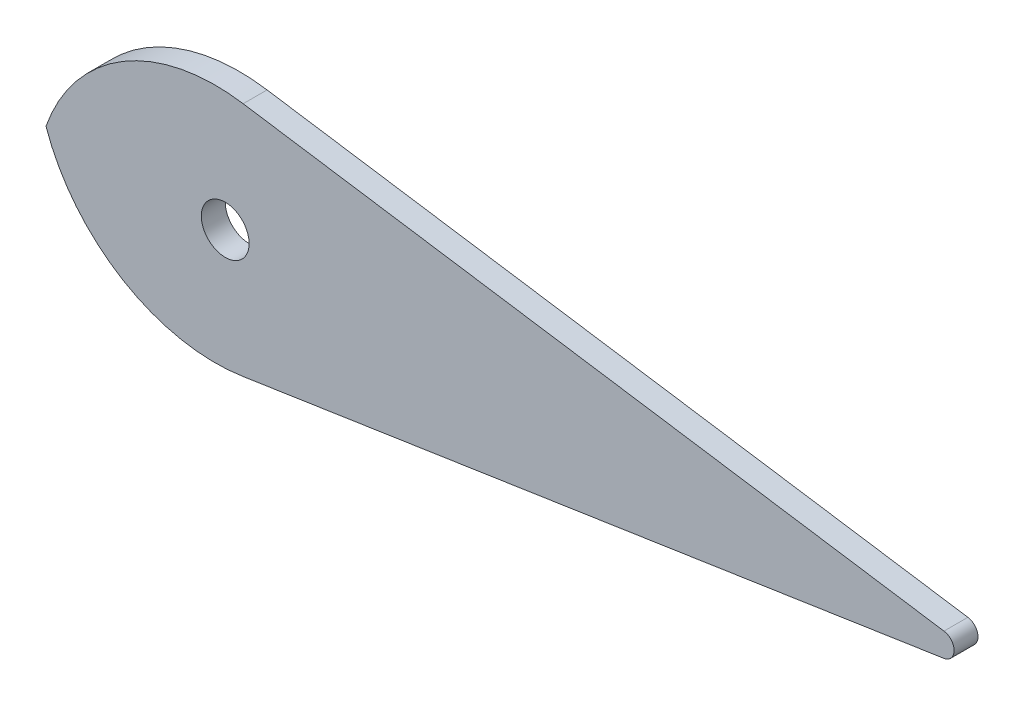
ISO-10303-21;
HEADER;
FILE_DESCRIPTION(('STEP AP214'),'2;1');
FILE_NAME('part.step','',(''),(''),'','','');
FILE_SCHEMA(('AUTOMOTIVE_DESIGN { 1 0 10303 214 1 1 1 1 }'));
ENDSEC;
DATA;
#1=APPLICATION_CONTEXT('core data for automotive mechanical design processes');
#2=APPLICATION_PROTOCOL_DEFINITION('international standard','automotive_design',2000,#1);
#3=PRODUCT_CONTEXT('',#1,'mechanical');
#4=PRODUCT('Part','Part','',(#3));
#5=PRODUCT_RELATED_PRODUCT_CATEGORY('part','',(#4));
#6=PRODUCT_DEFINITION_FORMATION('','',#4);
#7=PRODUCT_DEFINITION_CONTEXT('part definition',#1,'design');
#8=PRODUCT_DEFINITION('design','',#6,#7);
#9=PRODUCT_DEFINITION_SHAPE('','',#8);
#10=(LENGTH_UNIT() NAMED_UNIT(*) SI_UNIT(.MILLI.,.METRE.));
#11=(NAMED_UNIT(*) PLANE_ANGLE_UNIT() SI_UNIT($,.RADIAN.));
#12=(NAMED_UNIT(*) SI_UNIT($,.STERADIAN.) SOLID_ANGLE_UNIT());
#13=UNCERTAINTY_MEASURE_WITH_UNIT(LENGTH_MEASURE(1.E-05),#10,'distance_accuracy_value','');
#14=(GEOMETRIC_REPRESENTATION_CONTEXT(3) GLOBAL_UNCERTAINTY_ASSIGNED_CONTEXT((#13)) GLOBAL_UNIT_ASSIGNED_CONTEXT((#10,
#11,#12)) REPRESENTATION_CONTEXT('',''));
#15=CARTESIAN_POINT('',(0.,0.,0.));
#16=DIRECTION('',(0.,0.,1.));
#17=DIRECTION('',(1.,0.,0.));
#18=AXIS2_PLACEMENT_3D('',#15,#16,#17);
#19=CARTESIAN_POINT('',(-0.0416745972386433,0.246526111807577,0.1));
#20=DIRECTION('',(0.,0.,-1.));
#21=DIRECTION('',(-1.,0.,0.));
#22=AXIS2_PLACEMENT_3D('',#19,#20,#21);
#23=PLANE('',#22);
#24=CARTESIAN_POINT('',(-0.0416745972386433,0.246526111807577,0.1));
#25=DIRECTION('',(0.,0.,1.));
#26=DIRECTION('',(-1.,0.,0.));
#27=AXIS2_PLACEMENT_3D('',#24,#25,#26);
#28=CIRCLE('',#27,0.75);
#29=CARTESIAN_POINT('',(-0.75,0.,0.1));
#30=VERTEX_POINT('',#29);
#31=CARTESIAN_POINT('',(0.075,-0.49434299833213,0.1));
#32=VERTEX_POINT('',#31);
#33=EDGE_CURVE('E120',#30,#32,#28,.T.);
#34=ORIENTED_EDGE('',*,*,#33,.T.);
#35=DIRECTION('',(0.988685996664259,0.15,0.));
#36=VECTOR('',#35,1.);
#37=CARTESIAN_POINT('',(3.0075,-0.049434299833213,0.1));
#38=LINE('',#37,#36);
#39=CARTESIAN_POINT('',(3.0075,-0.0494342998332129,0.1));
#40=VERTEX_POINT('',#39);
#41=EDGE_CURVE('E87',#32,#40,#38,.T.);
#42=ORIENTED_EDGE('',*,*,#41,.T.);
#43=CARTESIAN_POINT('',(3.,0.,0.1));
#44=DIRECTION('',(0.,0.,1.));
#45=DIRECTION('',(1.,0.,0.));
#46=AXIS2_PLACEMENT_3D('',#43,#44,#45);
#47=CIRCLE('',#46,0.05);
#48=CARTESIAN_POINT('',(3.0075,0.0494342998332128,0.1));
#49=VERTEX_POINT('',#48);
#50=EDGE_CURVE('E91',#40,#49,#47,.T.);
#51=ORIENTED_EDGE('',*,*,#50,.T.);
#52=DIRECTION('',(-0.988685996664259,0.15,0.));
#53=VECTOR('',#52,1.);
#54=CARTESIAN_POINT('',(0.075,0.49434299833213,0.1));
#55=LINE('',#54,#53);
#56=CARTESIAN_POINT('',(0.0750000000000001,0.49434299833213,0.1));
#57=VERTEX_POINT('',#56);
#58=EDGE_CURVE('E95',#49,#57,#55,.T.);
#59=ORIENTED_EDGE('',*,*,#58,.T.);
#60=CARTESIAN_POINT('',(-0.0416745972386432,-0.246526111807577,0.1));
#61=DIRECTION('',(0.,0.,1.));
#62=DIRECTION('',(-1.,0.,0.));
#63=AXIS2_PLACEMENT_3D('',#60,#61,#62);
#64=CIRCLE('',#63,0.75);
#65=EDGE_CURVE('E53',#57,#30,#64,.T.);
#66=ORIENTED_EDGE('',*,*,#65,.T.);
#67=EDGE_LOOP('',(#34,#42,#51,#59,#66));
#68=FACE_BOUND('',#67,.T.);
#69=CARTESIAN_POINT('',(0.,0.,0.1));
#70=DIRECTION('',(0.,0.,1.));
#71=DIRECTION('',(1.,0.,0.));
#72=AXIS2_PLACEMENT_3D('',#69,#70,#71);
#73=CIRCLE('',#72,0.1);
#74=CARTESIAN_POINT('',(0.1,0.,0.1));
#75=VERTEX_POINT('',#74);
#76=EDGE_CURVE('E115',#75,#75,#73,.T.);
#77=ORIENTED_EDGE('',*,*,#76,.F.);
#78=EDGE_LOOP('',(#77));
#79=FACE_BOUND('',#78,.T.);
#80=ADVANCED_FACE('F36',(#68,#79),#23,.F.);
#81=CARTESIAN_POINT('',(-0.0416745972386433,0.246526111807577,0.));
#82=DIRECTION('',(0.,0.,-1.));
#83=DIRECTION('',(-1.,0.,0.));
#84=AXIS2_PLACEMENT_3D('',#81,#82,#83);
#85=PLANE('',#84);
#86=CARTESIAN_POINT('',(-0.0416745972386433,0.246526111807577,0.));
#87=DIRECTION('',(0.,0.,1.));
#88=DIRECTION('',(-1.,0.,0.));
#89=AXIS2_PLACEMENT_3D('',#86,#87,#88);
#90=CIRCLE('',#89,0.75);
#91=CARTESIAN_POINT('',(-0.75,0.,0.));
#92=VERTEX_POINT('',#91);
#93=CARTESIAN_POINT('',(0.075,-0.49434299833213,0.));
#94=VERTEX_POINT('',#93);
#95=EDGE_CURVE('E111',#92,#94,#90,.T.);
#96=ORIENTED_EDGE('',*,*,#95,.F.);
#97=CARTESIAN_POINT('',(-0.0416745972386432,-0.246526111807577,0.));
#98=DIRECTION('',(0.,0.,1.));
#99=DIRECTION('',(-1.,0.,0.));
#100=AXIS2_PLACEMENT_3D('',#97,#98,#99);
#101=CIRCLE('',#100,0.75);
#102=CARTESIAN_POINT('',(0.0750000000000001,0.49434299833213,0.));
#103=VERTEX_POINT('',#102);
#104=EDGE_CURVE('E79',#103,#92,#101,.T.);
#105=ORIENTED_EDGE('',*,*,#104,.F.);
#106=DIRECTION('',(-0.988685996664259,0.15,0.));
#107=VECTOR('',#106,1.);
#108=CARTESIAN_POINT('',(0.075,0.49434299833213,0.));
#109=LINE('',#108,#107);
#110=CARTESIAN_POINT('',(3.0075,0.0494342998332128,0.));
#111=VERTEX_POINT('',#110);
#112=EDGE_CURVE('E73',#111,#103,#109,.T.);
#113=ORIENTED_EDGE('',*,*,#112,.F.);
#114=CARTESIAN_POINT('',(3.,0.,0.));
#115=DIRECTION('',(0.,0.,1.));
#116=DIRECTION('',(1.,0.,0.));
#117=AXIS2_PLACEMENT_3D('',#114,#115,#116);
#118=CIRCLE('',#117,0.05);
#119=CARTESIAN_POINT('',(3.0075,-0.0494342998332129,0.));
#120=VERTEX_POINT('',#119);
#121=EDGE_CURVE('E102',#120,#111,#118,.T.);
#122=ORIENTED_EDGE('',*,*,#121,.F.);
#123=DIRECTION('',(0.988685996664259,0.15,0.));
#124=VECTOR('',#123,1.);
#125=CARTESIAN_POINT('',(3.0075,-0.049434299833213,0.));
#126=LINE('',#125,#124);
#127=EDGE_CURVE('E114',#94,#120,#126,.T.);
#128=ORIENTED_EDGE('',*,*,#127,.F.);
#129=EDGE_LOOP('',(#96,#105,#113,#122,#128));
#130=FACE_BOUND('',#129,.T.);
#131=CARTESIAN_POINT('',(0.,0.,0.));
#132=DIRECTION('',(0.,0.,1.));
#133=DIRECTION('',(1.,0.,0.));
#134=AXIS2_PLACEMENT_3D('',#131,#132,#133);
#135=CIRCLE('',#134,0.1);
#136=CARTESIAN_POINT('',(0.1,0.,0.));
#137=VERTEX_POINT('',#136);
#138=EDGE_CURVE('E200',#137,#137,#135,.T.);
#139=ORIENTED_EDGE('',*,*,#138,.T.);
#140=EDGE_LOOP('',(#139));
#141=FACE_BOUND('',#140,.T.);
#142=ADVANCED_FACE('F124',(#130,#141),#85,.T.);
#143=CARTESIAN_POINT('',(-0.0416745972386433,0.246526111807577,0.1));
#144=DIRECTION('',(0.,0.,-1.));
#145=DIRECTION('',(-1.,0.,0.));
#146=AXIS2_PLACEMENT_3D('',#143,#144,#145);
#147=CYLINDRICAL_SURFACE('',#146,0.75);
#148=ORIENTED_EDGE('',*,*,#95,.T.);
#149=DIRECTION('',(0.,0.,-1.));
#150=VECTOR('',#149,1.);
#151=CARTESIAN_POINT('',(0.075,-0.49434299833213,0.1));
#152=LINE('',#151,#150);
#153=EDGE_CURVE('E11',#32,#94,#152,.T.);
#154=ORIENTED_EDGE('',*,*,#153,.F.);
#155=ORIENTED_EDGE('',*,*,#33,.F.);
#156=DIRECTION('',(0.,0.,-1.));
#157=VECTOR('',#156,1.);
#158=CARTESIAN_POINT('',(-0.75,0.,0.1));
#159=LINE('',#158,#157);
#160=EDGE_CURVE('E107',#30,#92,#159,.T.);
#161=ORIENTED_EDGE('',*,*,#160,.T.);
#162=EDGE_LOOP('',(#148,#154,#155,#161));
#163=FACE_BOUND('',#162,.T.);
#164=ADVANCED_FACE('F38',(#163),#147,.T.);
#165=CARTESIAN_POINT('',(3.0075,-0.049434299833213,0.1));
#166=DIRECTION('',(-0.15,0.988685996664259,0.));
#167=DIRECTION('',(-0.988685996664259,-0.15,0.));
#168=AXIS2_PLACEMENT_3D('',#165,#166,#167);
#169=PLANE('',#168);
#170=ORIENTED_EDGE('',*,*,#127,.T.);
#171=DIRECTION('',(0.,0.,-1.));
#172=VECTOR('',#171,1.);
#173=CARTESIAN_POINT('',(3.0075,-0.0494342998332129,0.1));
#174=LINE('',#173,#172);
#175=EDGE_CURVE('E45',#40,#120,#174,.T.);
#176=ORIENTED_EDGE('',*,*,#175,.F.);
#177=ORIENTED_EDGE('',*,*,#41,.F.);
#178=ORIENTED_EDGE('',*,*,#153,.T.);
#179=EDGE_LOOP('',(#170,#176,#177,#178));
#180=FACE_BOUND('',#179,.T.);
#181=ADVANCED_FACE('F149',(#180),#169,.F.);
#182=CARTESIAN_POINT('',(3.,0.,0.1));
#183=DIRECTION('',(0.,0.,-1.));
#184=DIRECTION('',(-1.,0.,0.));
#185=AXIS2_PLACEMENT_3D('',#182,#183,#184);
#186=CYLINDRICAL_SURFACE('',#185,0.05);
#187=ORIENTED_EDGE('',*,*,#121,.T.);
#188=DIRECTION('',(0.,0.,-1.));
#189=VECTOR('',#188,1.);
#190=CARTESIAN_POINT('',(3.0075,0.0494342998332128,0.1));
#191=LINE('',#190,#189);
#192=EDGE_CURVE('E99',#49,#111,#191,.T.);
#193=ORIENTED_EDGE('',*,*,#192,.F.);
#194=ORIENTED_EDGE('',*,*,#50,.F.);
#195=ORIENTED_EDGE('',*,*,#175,.T.);
#196=EDGE_LOOP('',(#187,#193,#194,#195));
#197=FACE_BOUND('',#196,.T.);
#198=ADVANCED_FACE('F100',(#197),#186,.T.);
#199=CARTESIAN_POINT('',(0.075,0.49434299833213,0.1));
#200=DIRECTION('',(-0.15,-0.988685996664259,0.));
#201=DIRECTION('',(0.988685996664259,-0.15,0.));
#202=AXIS2_PLACEMENT_3D('',#199,#200,#201);
#203=PLANE('',#202);
#204=ORIENTED_EDGE('',*,*,#112,.T.);
#205=DIRECTION('',(0.,0.,-1.));
#206=VECTOR('',#205,1.);
#207=CARTESIAN_POINT('',(0.0750000000000001,0.49434299833213,0.1));
#208=LINE('',#207,#206);
#209=EDGE_CURVE('E103',#57,#103,#208,.T.);
#210=ORIENTED_EDGE('',*,*,#209,.F.);
#211=ORIENTED_EDGE('',*,*,#58,.F.);
#212=ORIENTED_EDGE('',*,*,#192,.T.);
#213=EDGE_LOOP('',(#204,#210,#211,#212));
#214=FACE_BOUND('',#213,.T.);
#215=ADVANCED_FACE('F105',(#214),#203,.F.);
#216=CARTESIAN_POINT('',(-0.0416745972386432,-0.246526111807577,0.1));
#217=DIRECTION('',(0.,0.,-1.));
#218=DIRECTION('',(-1.,0.,0.));
#219=AXIS2_PLACEMENT_3D('',#216,#217,#218);
#220=CYLINDRICAL_SURFACE('',#219,0.75);
#221=ORIENTED_EDGE('',*,*,#104,.T.);
#222=ORIENTED_EDGE('',*,*,#160,.F.);
#223=ORIENTED_EDGE('',*,*,#65,.F.);
#224=ORIENTED_EDGE('',*,*,#209,.T.);
#225=EDGE_LOOP('',(#221,#222,#223,#224));
#226=FACE_BOUND('',#225,.T.);
#227=ADVANCED_FACE('F129',(#226),#220,.T.);
#228=CARTESIAN_POINT('',(0.,0.,0.1));
#229=DIRECTION('',(0.,0.,-1.));
#230=DIRECTION('',(-1.,0.,0.));
#231=AXIS2_PLACEMENT_3D('',#228,#229,#230);
#232=CYLINDRICAL_SURFACE('',#231,0.1);
#233=ORIENTED_EDGE('',*,*,#76,.T.);
#234=EDGE_LOOP('',(#233));
#235=FACE_BOUND('',#234,.T.);
#236=ORIENTED_EDGE('',*,*,#138,.F.);
#237=EDGE_LOOP('',(#236));
#238=FACE_BOUND('',#237,.T.);
#239=ADVANCED_FACE('F131',(#235,#238),#232,.F.);
#240=CLOSED_SHELL('',(#80,#142,#164,#181,#198,#215,#227,#239));
#241=MANIFOLD_SOLID_BREP('B2',#240);
#242=ADVANCED_BREP_SHAPE_REPRESENTATION('',(#18,#241),#14);
#243=SHAPE_DEFINITION_REPRESENTATION(#9,#242);
ENDSEC;
END-ISO-10303-21;
